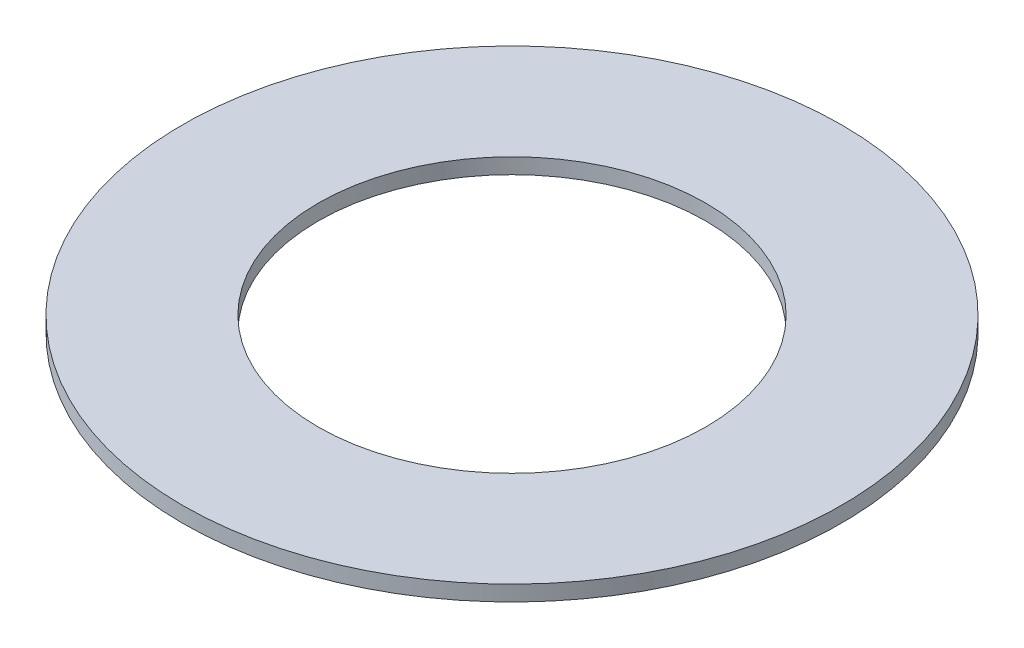
ISO-10303-21;
HEADER;
FILE_DESCRIPTION(('STEP AP214'),'2;1');
FILE_NAME('part.step','',(''),(''),'','','');
FILE_SCHEMA(('AUTOMOTIVE_DESIGN { 1 0 10303 214 1 1 1 1 }'));
ENDSEC;
DATA;
#1=APPLICATION_CONTEXT('core data for automotive mechanical design processes');
#2=APPLICATION_PROTOCOL_DEFINITION('international standard','automotive_design',2000,#1);
#3=PRODUCT_CONTEXT('',#1,'mechanical');
#4=PRODUCT('Part','Part','',(#3));
#5=PRODUCT_RELATED_PRODUCT_CATEGORY('part','',(#4));
#6=PRODUCT_DEFINITION_FORMATION('','',#4);
#7=PRODUCT_DEFINITION_CONTEXT('part definition',#1,'design');
#8=PRODUCT_DEFINITION('design','',#6,#7);
#9=PRODUCT_DEFINITION_SHAPE('','',#8);
#10=(LENGTH_UNIT() NAMED_UNIT(*) SI_UNIT(.MILLI.,.METRE.));
#11=(NAMED_UNIT(*) PLANE_ANGLE_UNIT() SI_UNIT($,.RADIAN.));
#12=(NAMED_UNIT(*) SI_UNIT($,.STERADIAN.) SOLID_ANGLE_UNIT());
#13=UNCERTAINTY_MEASURE_WITH_UNIT(LENGTH_MEASURE(1.E-05),#10,'distance_accuracy_value','');
#14=(GEOMETRIC_REPRESENTATION_CONTEXT(3) GLOBAL_UNCERTAINTY_ASSIGNED_CONTEXT((#13)) GLOBAL_UNIT_ASSIGNED_CONTEXT((#10,
#11,#12)) REPRESENTATION_CONTEXT('',''));
#15=CARTESIAN_POINT('',(0.,0.,0.));
#16=DIRECTION('',(0.,0.,1.));
#17=DIRECTION('',(1.,0.,0.));
#18=AXIS2_PLACEMENT_3D('',#15,#16,#17);
#19=CARTESIAN_POINT('',(0.,0.508,0.));
#20=DIRECTION('',(0.,-1.,0.));
#21=DIRECTION('',(0.,0.,-1.));
#22=AXIS2_PLACEMENT_3D('',#19,#20,#21);
#23=CYLINDRICAL_SURFACE('',#22,10.795);
#24=CARTESIAN_POINT('',(0.,0.508,0.));
#25=DIRECTION('',(0.,1.,0.));
#26=DIRECTION('',(0.,0.,1.));
#27=AXIS2_PLACEMENT_3D('',#24,#25,#26);
#28=CIRCLE('',#27,10.795);
#29=CARTESIAN_POINT('',(0.,0.508,10.795));
#30=VERTEX_POINT('',#29);
#31=EDGE_CURVE('E10',#30,#30,#28,.T.);
#32=ORIENTED_EDGE('',*,*,#31,.F.);
#33=EDGE_LOOP('',(#32));
#34=FACE_BOUND('',#33,.T.);
#35=CARTESIAN_POINT('',(0.,0.,0.));
#36=DIRECTION('',(0.,1.,0.));
#37=DIRECTION('',(0.,0.,1.));
#38=AXIS2_PLACEMENT_3D('',#35,#36,#37);
#39=CIRCLE('',#38,10.795);
#40=CARTESIAN_POINT('',(0.,0.,10.795));
#41=VERTEX_POINT('',#40);
#42=EDGE_CURVE('E46',#41,#41,#39,.T.);
#43=ORIENTED_EDGE('',*,*,#42,.T.);
#44=EDGE_LOOP('',(#43));
#45=FACE_BOUND('',#44,.T.);
#46=ADVANCED_FACE('F43',(#34,#45),#23,.T.);
#47=CARTESIAN_POINT('',(0.,0.508,0.));
#48=DIRECTION('',(0.,1.,0.));
#49=DIRECTION('',(0.,0.,1.));
#50=AXIS2_PLACEMENT_3D('',#47,#48,#49);
#51=PLANE('',#50);
#52=CARTESIAN_POINT('',(0.,0.508,0.));
#53=DIRECTION('',(0.,1.,0.));
#54=DIRECTION('',(0.,0.,1.));
#55=AXIS2_PLACEMENT_3D('',#52,#53,#54);
#56=CIRCLE('',#55,6.35);
#57=CARTESIAN_POINT('',(0.,0.508,6.35));
#58=VERTEX_POINT('',#57);
#59=EDGE_CURVE('E57',#58,#58,#56,.T.);
#60=ORIENTED_EDGE('',*,*,#59,.F.);
#61=EDGE_LOOP('',(#60));
#62=FACE_BOUND('',#61,.T.);
#63=ORIENTED_EDGE('',*,*,#31,.T.);
#64=EDGE_LOOP('',(#63));
#65=FACE_BOUND('',#64,.T.);
#66=ADVANCED_FACE('F74',(#62,#65),#51,.T.);
#67=CARTESIAN_POINT('',(0.,0.,0.));
#68=DIRECTION('',(0.,1.,0.));
#69=DIRECTION('',(0.,0.,1.));
#70=AXIS2_PLACEMENT_3D('',#67,#68,#69);
#71=PLANE('',#70);
#72=CARTESIAN_POINT('',(0.,0.,0.));
#73=DIRECTION('',(0.,1.,0.));
#74=DIRECTION('',(0.,0.,1.));
#75=AXIS2_PLACEMENT_3D('',#72,#73,#74);
#76=CIRCLE('',#75,6.35);
#77=CARTESIAN_POINT('',(0.,0.,6.35));
#78=VERTEX_POINT('',#77);
#79=EDGE_CURVE('E55',#78,#78,#76,.T.);
#80=ORIENTED_EDGE('',*,*,#79,.T.);
#81=EDGE_LOOP('',(#80));
#82=FACE_BOUND('',#81,.T.);
#83=ORIENTED_EDGE('',*,*,#42,.F.);
#84=EDGE_LOOP('',(#83));
#85=FACE_BOUND('',#84,.T.);
#86=ADVANCED_FACE('F65',(#82,#85),#71,.F.);
#87=CARTESIAN_POINT('',(0.,0.,0.));
#88=DIRECTION('',(0.,1.,0.));
#89=DIRECTION('',(0.,0.,1.));
#90=AXIS2_PLACEMENT_3D('',#87,#88,#89);
#91=CYLINDRICAL_SURFACE('',#90,6.35);
#92=ORIENTED_EDGE('',*,*,#79,.F.);
#93=EDGE_LOOP('',(#92));
#94=FACE_BOUND('',#93,.T.);
#95=ORIENTED_EDGE('',*,*,#59,.T.);
#96=EDGE_LOOP('',(#95));
#97=FACE_BOUND('',#96,.T.);
#98=ADVANCED_FACE('F68',(#94,#97),#91,.F.);
#99=CLOSED_SHELL('',(#46,#66,#86,#98));
#100=MANIFOLD_SOLID_BREP('B2',#99);
#101=ADVANCED_BREP_SHAPE_REPRESENTATION('',(#18,#100),#14);
#102=SHAPE_DEFINITION_REPRESENTATION(#9,#101);
ENDSEC;
END-ISO-10303-21;
